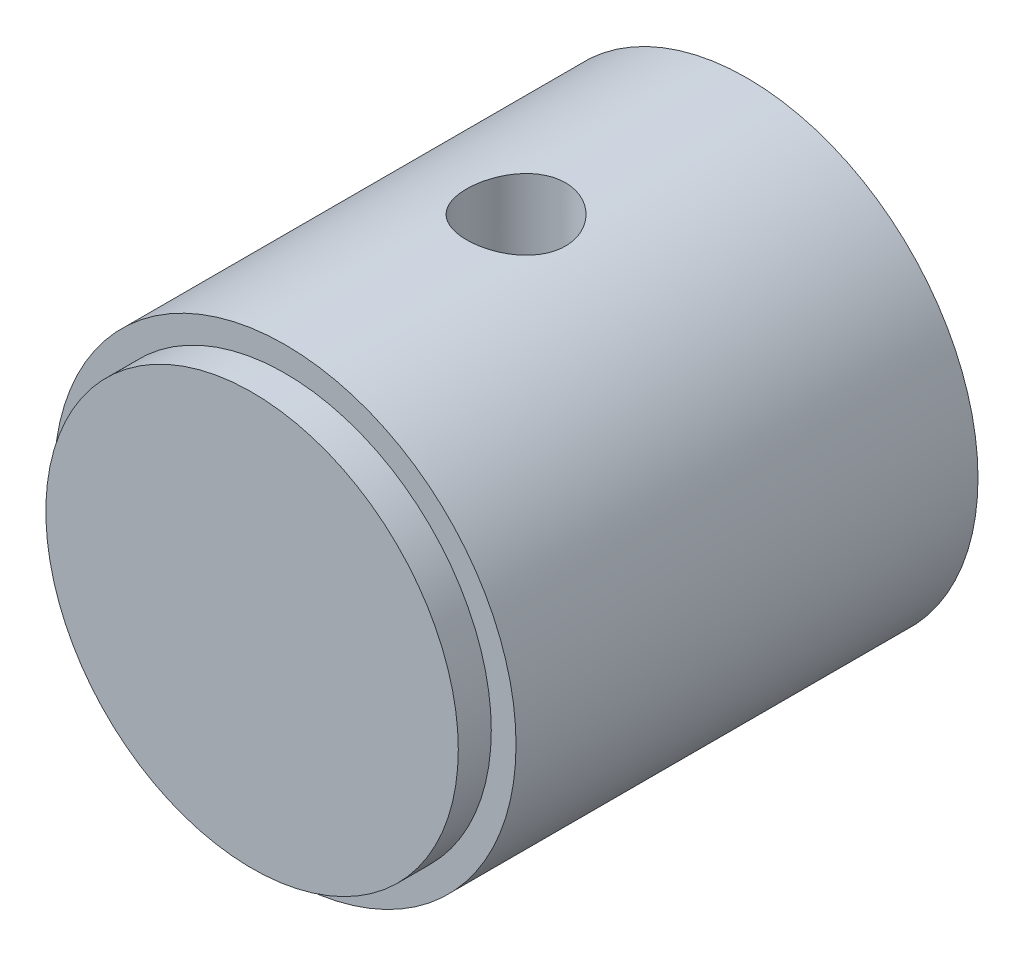
ISO-10303-21;
HEADER;
FILE_DESCRIPTION(('STEP AP214'),'2;1');
FILE_NAME('part.step','',(''),(''),'','','');
FILE_SCHEMA(('AUTOMOTIVE_DESIGN { 1 0 10303 214 1 1 1 1 }'));
ENDSEC;
DATA;
#1=APPLICATION_CONTEXT('core data for automotive mechanical design processes');
#2=APPLICATION_PROTOCOL_DEFINITION('international standard','automotive_design',2000,#1);
#3=PRODUCT_CONTEXT('',#1,'mechanical');
#4=PRODUCT('Part','Part','',(#3));
#5=PRODUCT_RELATED_PRODUCT_CATEGORY('part','',(#4));
#6=PRODUCT_DEFINITION_FORMATION('','',#4);
#7=PRODUCT_DEFINITION_CONTEXT('part definition',#1,'design');
#8=PRODUCT_DEFINITION('design','',#6,#7);
#9=PRODUCT_DEFINITION_SHAPE('','',#8);
#10=(LENGTH_UNIT() NAMED_UNIT(*) SI_UNIT(.MILLI.,.METRE.));
#11=(NAMED_UNIT(*) PLANE_ANGLE_UNIT() SI_UNIT($,.RADIAN.));
#12=(NAMED_UNIT(*) SI_UNIT($,.STERADIAN.) SOLID_ANGLE_UNIT());
#13=UNCERTAINTY_MEASURE_WITH_UNIT(LENGTH_MEASURE(1.E-05),#10,'distance_accuracy_value','');
#14=(GEOMETRIC_REPRESENTATION_CONTEXT(3) GLOBAL_UNCERTAINTY_ASSIGNED_CONTEXT((#13)) GLOBAL_UNIT_ASSIGNED_CONTEXT((#10,
#11,#12)) REPRESENTATION_CONTEXT('',''));
#15=CARTESIAN_POINT('',(0.,0.,0.));
#16=DIRECTION('',(0.,0.,1.));
#17=DIRECTION('',(1.,0.,0.));
#18=AXIS2_PLACEMENT_3D('',#15,#16,#17);
#19=CARTESIAN_POINT('',(0.,0.,7.));
#20=DIRECTION('',(0.,0.,-1.));
#21=DIRECTION('',(-1.,0.,0.));
#22=AXIS2_PLACEMENT_3D('',#19,#20,#21);
#23=CYLINDRICAL_SURFACE('',#22,7.);
#24=CARTESIAN_POINT('',(0.,-7.,1.5));
#25=CARTESIAN_POINT('',(0.0832358860906166,-6.99999846043226,1.4999971004257));
#26=CARTESIAN_POINT('',(0.166507195600275,-6.9985002594971,1.49304839161214));
#27=CARTESIAN_POINT('',(0.330687344293327,-6.99266829827728,1.46546434314641));
#28=CARTESIAN_POINT('',(0.41159440357119,-6.98833245637099,1.44481895580507));
#29=CARTESIAN_POINT('',(0.568649323817736,-6.97730831788826,1.39051563539196));
#30=CARTESIAN_POINT('',(0.644801963446555,-6.97062242967171,1.35687102061868));
#31=CARTESIAN_POINT('',(0.790378177960787,-6.9556210681797,1.27756591382874));
#32=CARTESIAN_POINT('',(0.859801981747369,-6.94730565036661,1.23190583075006));
#33=CARTESIAN_POINT('',(0.991024790535229,-6.92981369246311,1.12911970032649));
#34=CARTESIAN_POINT('',(1.05270503419445,-6.92062683143259,1.07184377810147));
#35=CARTESIAN_POINT('',(1.16566042389435,-6.90250069814144,0.947773684314803));
#36=CARTESIAN_POINT('',(1.21693467150908,-6.8935614473163,0.880978691748742));
#37=CARTESIAN_POINT('',(1.30814204379809,-6.87684116047225,0.738894247139567));
#38=CARTESIAN_POINT('',(1.34794958335009,-6.8690733634436,0.66352248224379));
#39=CARTESIAN_POINT('',(1.41428823691148,-6.85572325558537,0.506965546233162));
#40=CARTESIAN_POINT('',(1.44082087001716,-6.85014069470711,0.425781041507426));
#41=CARTESIAN_POINT('',(1.47946574422454,-6.84189808926311,0.261188913411926));
#42=CARTESIAN_POINT('',(1.49178779748342,-6.83919556896486,0.177832724336135));
#43=CARTESIAN_POINT('',(1.50231395206577,-6.83689139845106,0.0101957674930052));
#44=CARTESIAN_POINT('',(1.50051971664629,-6.83728938291729,-0.0740848901799469));
#45=CARTESIAN_POINT('',(1.48303326340861,-6.84110276603832,-0.239624687933792));
#46=CARTESIAN_POINT('',(1.46758398649408,-6.84446541682162,-0.320910889100153));
#47=CARTESIAN_POINT('',(1.42361054298677,-6.85374593375788,-0.479710240289342));
#48=CARTESIAN_POINT('',(1.39508566936466,-6.85966393808402,-0.557223186032321));
#49=CARTESIAN_POINT('',(1.32554551075991,-6.87344080755724,-0.706962872873338));
#50=CARTESIAN_POINT('',(1.2844361097283,-6.88131420983365,-0.779144512712551));
#51=CARTESIAN_POINT('',(1.19096007283993,-6.89810572501288,-0.915675164957958));
#52=CARTESIAN_POINT('',(1.13859196103562,-6.90702397481896,-0.980023148686202));
#53=CARTESIAN_POINT('',(1.0227954275532,-6.92512718393878,-1.1004593556734));
#54=CARTESIAN_POINT('',(0.95916023396441,-6.93431383972178,-1.15634870658474));
#55=CARTESIAN_POINT('',(0.823317306269096,-6.95175017497059,-1.25669373368966));
#56=CARTESIAN_POINT('',(0.7511094287754,-6.95999983875972,-1.30114921860039));
#57=CARTESIAN_POINT('',(0.599933462049959,-6.97465778534003,-1.37741067990693));
#58=CARTESIAN_POINT('',(0.520952258863482,-6.98106238643354,-1.40919141257798));
#59=CARTESIAN_POINT('',(0.358603146685706,-6.99128109245334,-1.45897564832109));
#60=CARTESIAN_POINT('',(0.275235851133669,-6.99509555860384,-1.47698107256332));
#61=CARTESIAN_POINT('',(0.108187670836629,-6.99965306347808,-1.49841621414342));
#62=CARTESIAN_POINT('',(0.0245431772716148,-7.00045336521066,-1.50211771288178));
#63=CARTESIAN_POINT('',(-0.142168973650405,-6.99905248935969,-1.49557542887484));
#64=CARTESIAN_POINT('',(-0.225236668127255,-6.99685150675698,-1.48533255203706));
#65=CARTESIAN_POINT('',(-0.387542537982806,-6.98973143045266,-1.4514177563383));
#66=CARTESIAN_POINT('',(-0.466811712908477,-6.9848410504546,-1.42788763052747));
#67=CARTESIAN_POINT('',(-0.620278450473418,-6.9728892442151,-1.36822305700518));
#68=CARTESIAN_POINT('',(-0.69447559258774,-6.96582763822237,-1.33208756568835));
#69=CARTESIAN_POINT('',(-0.836821397964754,-6.950175043904,-1.24766645693967));
#70=CARTESIAN_POINT('',(-0.90487257511114,-6.94156431354275,-1.19922020509027));
#71=CARTESIAN_POINT('',(-1.0319769255236,-6.92381033034847,-1.09176517511126));
#72=CARTESIAN_POINT('',(-1.091028978692,-6.91466701142097,-1.03275508411256));
#73=CARTESIAN_POINT('',(-1.19952711057989,-6.89668172706324,-0.904602629812864));
#74=CARTESIAN_POINT('',(-1.24878537255157,-6.88784792221285,-0.835299900777896));
#75=CARTESIAN_POINT('',(-1.3349641538604,-6.87166654559681,-0.689245403522007));
#76=CARTESIAN_POINT('',(-1.37188519913706,-6.86431891048055,-0.612493953022508));
#77=CARTESIAN_POINT('',(-1.43209741248548,-6.8520100980739,-0.454127701005397));
#78=CARTESIAN_POINT('',(-1.45546398641275,-6.84703574582967,-0.372542643569332));
#79=CARTESIAN_POINT('',(-1.48812696085335,-6.84001186708418,-0.206484416166364));
#80=CARTESIAN_POINT('',(-1.49742550780258,-6.83796189439706,-0.12201168879868));
#81=CARTESIAN_POINT('',(-1.5015999992604,-6.83704618848155,0.0455323431752432));
#82=CARTESIAN_POINT('',(-1.49677347258311,-6.83811476518543,0.128596014980579));
#83=CARTESIAN_POINT('',(-1.47349789406331,-6.8431676318483,0.292697242132587));
#84=CARTESIAN_POINT('',(-1.45504898957979,-6.84715189026714,0.373734819386574));
#85=CARTESIAN_POINT('',(-1.40519345940434,-6.85755581104157,0.531258657869168));
#86=CARTESIAN_POINT('',(-1.37382847170887,-6.86396764224703,0.607758648664291));
#87=CARTESIAN_POINT('',(-1.29906751595601,-6.87850764590649,0.75445537250685));
#88=CARTESIAN_POINT('',(-1.255670353015,-6.88663598880363,0.824651478615045));
#89=CARTESIAN_POINT('',(-1.15708290349304,-6.90389055593232,0.958218193725365));
#90=CARTESIAN_POINT('',(-1.10167987421237,-6.91303309938926,1.02142969594698));
#91=CARTESIAN_POINT('',(-0.981086554619621,-6.93117449799694,1.13775626252046));
#92=CARTESIAN_POINT('',(-0.915894009385597,-6.94017331951296,1.19086899431221));
#93=CARTESIAN_POINT('',(-0.776603147268716,-6.95714491048987,1.28611595950556));
#94=CARTESIAN_POINT('',(-0.70240484600964,-6.96510364570626,1.32810660623098));
#95=CARTESIAN_POINT('',(-0.547850160940597,-6.97895826104019,1.39895452890618));
#96=CARTESIAN_POINT('',(-0.467499105863879,-6.98485590212343,1.42782302258504));
#97=CARTESIAN_POINT('',(-0.322535217553204,-6.99284848461772,1.46635218513115));
#98=CARTESIAN_POINT('',(-0.258717205545979,-6.99551391888263,1.47894643398003));
#99=CARTESIAN_POINT('',(-0.129939960853847,-6.99909024154719,1.49577130171167));
#100=CARTESIAN_POINT('',(-0.0649807750887453,-7.00000120191314,1.50000226364606));
#101=CARTESIAN_POINT('',(0.,-7.,1.5));
#102=B_SPLINE_CURVE_WITH_KNOTS('',3,(#24,#25,#26,#27,#28,#29,#30,#31,#32,#33,#34,#35,#36,#37,
#38,#39,#40,#41,#42,#43,#44,#45,#46,#47,#48,#49,#50,#51,#52,#53,#54,#55,#56,#57,#58,#59,#60,#61,
#62,#63,#64,#65,#66,#67,#68,#69,#70,#71,#72,#73,#74,#75,#76,#77,#78,#79,#80,#81,#82,#83,#84,#85,
#86,#87,#88,#89,#90,#91,#92,#93,#94,#95,#96,#97,#98,#99,#100,#101),.UNSPECIFIED.,.T.,.F.,(4,2,2,
2,2,2,2,2,2,2,2,2,2,2,2,2,2,2,2,2,2,2,2,2,2,2,2,2,2,2,2,2,2,2,2,2,2,2,4),(0.,0.249469836512082,
0.499122883219936,0.748520824425602,0.997910278645886,1.25074961881732,1.50361077918506,
1.7591442921451,2.0146485567749,2.26633008124666,2.51798195169165,2.76524475452928,
3.01252092904568,3.26169356165968,3.51089887920889,3.76527011050291,4.0196455970235,
4.27452521139806,4.52936927256343,4.77934665704185,5.02930780231429,5.27665060589267,
5.52401389198434,5.77478733867803,6.02559197304485,6.28082063283534,6.53603841075806,
6.78982240408475,7.04356767229185,7.29200680540294,7.5404432510827,7.78808499706785,
8.03575134451623,8.28822950154114,8.54076590397115,8.79641910357222,9.05185334010271,
9.24661799132294,9.44137465337336),.UNSPECIFIED.);
#103=CARTESIAN_POINT('',(0.,-7.,1.5));
#104=VERTEX_POINT('',#103);
#105=EDGE_CURVE('E99',#104,#104,#102,.T.);
#106=ORIENTED_EDGE('',*,*,#105,.T.);
#107=EDGE_LOOP('',(#106));
#108=FACE_BOUND('',#107,.T.);
#109=CARTESIAN_POINT('',(0.,7.,1.5));
#110=CARTESIAN_POINT('',(-0.0832358860906166,6.99999846043226,1.4999971004257));
#111=CARTESIAN_POINT('',(-0.166507195600275,6.9985002594971,1.49304839161214));
#112=CARTESIAN_POINT('',(-0.330687344293327,6.99266829827728,1.46546434314641));
#113=CARTESIAN_POINT('',(-0.41159440357119,6.98833245637099,1.44481895580507));
#114=CARTESIAN_POINT('',(-0.568649323817736,6.97730831788826,1.39051563539196));
#115=CARTESIAN_POINT('',(-0.644801963446555,6.97062242967171,1.35687102061868));
#116=CARTESIAN_POINT('',(-0.790378177960787,6.9556210681797,1.27756591382874));
#117=CARTESIAN_POINT('',(-0.859801981747369,6.94730565036661,1.23190583075006));
#118=CARTESIAN_POINT('',(-0.991024790535229,6.92981369246311,1.12911970032649));
#119=CARTESIAN_POINT('',(-1.05270503419445,6.92062683143259,1.07184377810147));
#120=CARTESIAN_POINT('',(-1.16566042389435,6.90250069814144,0.947773684314803));
#121=CARTESIAN_POINT('',(-1.21693467150908,6.8935614473163,0.880978691748742));
#122=CARTESIAN_POINT('',(-1.30814204379809,6.87684116047225,0.738894247139567));
#123=CARTESIAN_POINT('',(-1.34794958335009,6.8690733634436,0.66352248224379));
#124=CARTESIAN_POINT('',(-1.41428823691148,6.85572325558537,0.506965546233162));
#125=CARTESIAN_POINT('',(-1.44082087001716,6.85014069470711,0.425781041507426));
#126=CARTESIAN_POINT('',(-1.47946574422454,6.84189808926311,0.261188913411926));
#127=CARTESIAN_POINT('',(-1.49178779748342,6.83919556896486,0.177832724336135));
#128=CARTESIAN_POINT('',(-1.50231395206577,6.83689139845106,0.0101957674930052));
#129=CARTESIAN_POINT('',(-1.50051971664629,6.83728938291729,-0.0740848901799469));
#130=CARTESIAN_POINT('',(-1.48303326340861,6.84110276603832,-0.239624687933792));
#131=CARTESIAN_POINT('',(-1.46758398649408,6.84446541682162,-0.320910889100153));
#132=CARTESIAN_POINT('',(-1.42361054298677,6.85374593375788,-0.479710240289342));
#133=CARTESIAN_POINT('',(-1.39508566936466,6.85966393808402,-0.557223186032321));
#134=CARTESIAN_POINT('',(-1.32554551075991,6.87344080755724,-0.706962872873338));
#135=CARTESIAN_POINT('',(-1.2844361097283,6.88131420983365,-0.779144512712551));
#136=CARTESIAN_POINT('',(-1.19096007283993,6.89810572501288,-0.915675164957958));
#137=CARTESIAN_POINT('',(-1.13859196103562,6.90702397481896,-0.980023148686202));
#138=CARTESIAN_POINT('',(-1.0227954275532,6.92512718393878,-1.1004593556734));
#139=CARTESIAN_POINT('',(-0.95916023396441,6.93431383972178,-1.15634870658474));
#140=CARTESIAN_POINT('',(-0.823317306269096,6.95175017497059,-1.25669373368966));
#141=CARTESIAN_POINT('',(-0.7511094287754,6.95999983875972,-1.30114921860039));
#142=CARTESIAN_POINT('',(-0.599933462049959,6.97465778534003,-1.37741067990693));
#143=CARTESIAN_POINT('',(-0.520952258863482,6.98106238643354,-1.40919141257798));
#144=CARTESIAN_POINT('',(-0.358603146685706,6.99128109245334,-1.45897564832109));
#145=CARTESIAN_POINT('',(-0.275235851133669,6.99509555860384,-1.47698107256332));
#146=CARTESIAN_POINT('',(-0.108187670836629,6.99965306347808,-1.49841621414342));
#147=CARTESIAN_POINT('',(-0.0245431772716148,7.00045336521066,-1.50211771288178));
#148=CARTESIAN_POINT('',(0.142168973650405,6.99905248935969,-1.49557542887484));
#149=CARTESIAN_POINT('',(0.225236668127255,6.99685150675698,-1.48533255203706));
#150=CARTESIAN_POINT('',(0.387542537982806,6.98973143045266,-1.4514177563383));
#151=CARTESIAN_POINT('',(0.466811712908477,6.9848410504546,-1.42788763052747));
#152=CARTESIAN_POINT('',(0.620278450473418,6.9728892442151,-1.36822305700518));
#153=CARTESIAN_POINT('',(0.69447559258774,6.96582763822237,-1.33208756568835));
#154=CARTESIAN_POINT('',(0.836821397964754,6.950175043904,-1.24766645693967));
#155=CARTESIAN_POINT('',(0.90487257511114,6.94156431354275,-1.19922020509027));
#156=CARTESIAN_POINT('',(1.0319769255236,6.92381033034847,-1.09176517511126));
#157=CARTESIAN_POINT('',(1.091028978692,6.91466701142097,-1.03275508411256));
#158=CARTESIAN_POINT('',(1.19952711057989,6.89668172706324,-0.904602629812864));
#159=CARTESIAN_POINT('',(1.24878537255157,6.88784792221285,-0.835299900777896));
#160=CARTESIAN_POINT('',(1.3349641538604,6.87166654559681,-0.689245403522007));
#161=CARTESIAN_POINT('',(1.37188519913706,6.86431891048055,-0.612493953022508));
#162=CARTESIAN_POINT('',(1.43209741248548,6.8520100980739,-0.454127701005397));
#163=CARTESIAN_POINT('',(1.45546398641275,6.84703574582967,-0.372542643569332));
#164=CARTESIAN_POINT('',(1.48812696085335,6.84001186708418,-0.206484416166364));
#165=CARTESIAN_POINT('',(1.49742550780258,6.83796189439706,-0.12201168879868));
#166=CARTESIAN_POINT('',(1.5015999992604,6.83704618848155,0.0455323431752432));
#167=CARTESIAN_POINT('',(1.49677347258311,6.83811476518543,0.128596014980579));
#168=CARTESIAN_POINT('',(1.47349789406331,6.8431676318483,0.292697242132587));
#169=CARTESIAN_POINT('',(1.45504898957979,6.84715189026714,0.373734819386574));
#170=CARTESIAN_POINT('',(1.40519345940434,6.85755581104157,0.531258657869168));
#171=CARTESIAN_POINT('',(1.37382847170887,6.86396764224703,0.607758648664291));
#172=CARTESIAN_POINT('',(1.29906751595601,6.87850764590649,0.75445537250685));
#173=CARTESIAN_POINT('',(1.255670353015,6.88663598880363,0.824651478615045));
#174=CARTESIAN_POINT('',(1.15708290349304,6.90389055593232,0.958218193725365));
#175=CARTESIAN_POINT('',(1.10167987421237,6.91303309938926,1.02142969594698));
#176=CARTESIAN_POINT('',(0.981086554619621,6.93117449799694,1.13775626252046));
#177=CARTESIAN_POINT('',(0.915894009385597,6.94017331951296,1.19086899431221));
#178=CARTESIAN_POINT('',(0.776603147268716,6.95714491048987,1.28611595950556));
#179=CARTESIAN_POINT('',(0.70240484600964,6.96510364570626,1.32810660623098));
#180=CARTESIAN_POINT('',(0.547850160940597,6.97895826104019,1.39895452890618));
#181=CARTESIAN_POINT('',(0.467499105863879,6.98485590212343,1.42782302258504));
#182=CARTESIAN_POINT('',(0.322535217553204,6.99284848461772,1.46635218513115));
#183=CARTESIAN_POINT('',(0.258717205545979,6.99551391888263,1.47894643398003));
#184=CARTESIAN_POINT('',(0.129939960853847,6.99909024154719,1.49577130171167));
#185=CARTESIAN_POINT('',(0.0649807750887453,7.00000120191314,1.50000226364606));
#186=CARTESIAN_POINT('',(0.,7.,1.5));
#187=B_SPLINE_CURVE_WITH_KNOTS('',3,(#109,#110,#111,#112,#113,#114,#115,#116,#117,#118,#119,
#120,#121,#122,#123,#124,#125,#126,#127,#128,#129,#130,#131,#132,#133,#134,#135,#136,#137,#138,
#139,#140,#141,#142,#143,#144,#145,#146,#147,#148,#149,#150,#151,#152,#153,#154,#155,#156,#157,
#158,#159,#160,#161,#162,#163,#164,#165,#166,#167,#168,#169,#170,#171,#172,#173,#174,#175,#176,
#177,#178,#179,#180,#181,#182,#183,#184,#185,#186),.UNSPECIFIED.,.T.,.F.,(4,2,2,2,2,2,2,2,2,2,2,
2,2,2,2,2,2,2,2,2,2,2,2,2,2,2,2,2,2,2,2,2,2,2,2,2,2,2,4),(0.,0.249469836512082,
0.499122883219936,0.748520824425602,0.997910278645886,1.25074961881732,1.50361077918506,
1.7591442921451,2.0146485567749,2.26633008124666,2.51798195169165,2.76524475452928,
3.01252092904568,3.26169356165968,3.51089887920889,3.76527011050291,4.0196455970235,
4.27452521139806,4.52936927256343,4.77934665704185,5.02930780231429,5.27665060589267,
5.52401389198434,5.77478733867803,6.02559197304485,6.28082063283534,6.53603841075806,
6.78982240408475,7.04356767229185,7.29200680540294,7.5404432510827,7.78808499706785,
8.03575134451623,8.28822950154114,8.54076590397115,8.79641910357222,9.05185334010271,
9.24661799132294,9.44137465337336),.UNSPECIFIED.);
#188=CARTESIAN_POINT('',(0.,7.,1.5));
#189=VERTEX_POINT('',#188);
#190=EDGE_CURVE('E94',#189,#189,#187,.T.);
#191=ORIENTED_EDGE('',*,*,#190,.T.);
#192=EDGE_LOOP('',(#191));
#193=FACE_BOUND('',#192,.T.);
#194=CARTESIAN_POINT('',(0.,0.,7.));
#195=DIRECTION('',(0.,0.,1.));
#196=DIRECTION('',(1.,0.,0.));
#197=AXIS2_PLACEMENT_3D('',#194,#195,#196);
#198=CIRCLE('',#197,7.);
#199=CARTESIAN_POINT('',(7.,0.,7.));
#200=VERTEX_POINT('',#199);
#201=EDGE_CURVE('E11',#200,#200,#198,.T.);
#202=ORIENTED_EDGE('',*,*,#201,.F.);
#203=EDGE_LOOP('',(#202));
#204=FACE_BOUND('',#203,.T.);
#205=CARTESIAN_POINT('',(0.,0.,-7.));
#206=DIRECTION('',(0.,0.,1.));
#207=DIRECTION('',(1.,0.,0.));
#208=AXIS2_PLACEMENT_3D('',#205,#206,#207);
#209=CIRCLE('',#208,7.);
#210=CARTESIAN_POINT('',(7.,0.,-7.));
#211=VERTEX_POINT('',#210);
#212=EDGE_CURVE('E49',#211,#211,#209,.T.);
#213=ORIENTED_EDGE('',*,*,#212,.T.);
#214=EDGE_LOOP('',(#213));
#215=FACE_BOUND('',#214,.T.);
#216=ADVANCED_FACE('F36',(#108,#193,#204,#215),#23,.T.);
#217=CARTESIAN_POINT('',(0.,0.,7.));
#218=DIRECTION('',(0.,0.,1.));
#219=DIRECTION('',(1.,0.,0.));
#220=AXIS2_PLACEMENT_3D('',#217,#218,#219);
#221=PLANE('',#220);
#222=CARTESIAN_POINT('',(0.,0.,7.));
#223=DIRECTION('',(0.,0.,1.));
#224=DIRECTION('',(1.,0.,0.));
#225=AXIS2_PLACEMENT_3D('',#222,#223,#224);
#226=CIRCLE('',#225,6.25);
#227=CARTESIAN_POINT('',(6.25,0.,7.));
#228=VERTEX_POINT('',#227);
#229=EDGE_CURVE('E67',#228,#228,#226,.F.);
#230=ORIENTED_EDGE('',*,*,#229,.T.);
#231=EDGE_LOOP('',(#230));
#232=FACE_BOUND('',#231,.T.);
#233=ORIENTED_EDGE('',*,*,#201,.T.);
#234=EDGE_LOOP('',(#233));
#235=FACE_BOUND('',#234,.T.);
#236=ADVANCED_FACE('F112',(#232,#235),#221,.T.);
#237=CARTESIAN_POINT('',(0.,0.,-7.));
#238=DIRECTION('',(0.,0.,1.));
#239=DIRECTION('',(1.,0.,0.));
#240=AXIS2_PLACEMENT_3D('',#237,#238,#239);
#241=PLANE('',#240);
#242=CARTESIAN_POINT('',(0.,0.,-7.));
#243=DIRECTION('',(0.,0.,-1.));
#244=DIRECTION('',(-1.,0.,0.));
#245=AXIS2_PLACEMENT_3D('',#242,#243,#244);
#246=CIRCLE('',#245,6.2);
#247=CARTESIAN_POINT('',(-6.2,0.,-7.));
#248=VERTEX_POINT('',#247);
#249=EDGE_CURVE('E70',#248,#248,#246,.T.);
#250=ORIENTED_EDGE('',*,*,#249,.F.);
#251=EDGE_LOOP('',(#250));
#252=FACE_BOUND('',#251,.T.);
#253=ORIENTED_EDGE('',*,*,#212,.F.);
#254=EDGE_LOOP('',(#253));
#255=FACE_BOUND('',#254,.T.);
#256=ADVANCED_FACE('F108',(#252,#255),#241,.F.);
#257=CARTESIAN_POINT('',(0.,0.,8.));
#258=DIRECTION('',(0.,0.,-1.));
#259=DIRECTION('',(-1.,0.,0.));
#260=AXIS2_PLACEMENT_3D('',#257,#258,#259);
#261=CYLINDRICAL_SURFACE('',#260,6.25);
#262=ORIENTED_EDGE('',*,*,#229,.F.);
#263=EDGE_LOOP('',(#262));
#264=FACE_BOUND('',#263,.T.);
#265=CARTESIAN_POINT('',(0.,0.,8.));
#266=DIRECTION('',(0.,0.,1.));
#267=DIRECTION('',(1.,0.,0.));
#268=AXIS2_PLACEMENT_3D('',#265,#266,#267);
#269=CIRCLE('',#268,6.25);
#270=CARTESIAN_POINT('',(6.25,0.,8.));
#271=VERTEX_POINT('',#270);
#272=EDGE_CURVE('E63',#271,#271,#269,.T.);
#273=ORIENTED_EDGE('',*,*,#272,.F.);
#274=EDGE_LOOP('',(#273));
#275=FACE_BOUND('',#274,.T.);
#276=ADVANCED_FACE('F111',(#264,#275),#261,.T.);
#277=CARTESIAN_POINT('',(0.,0.,8.));
#278=DIRECTION('',(0.,0.,1.));
#279=DIRECTION('',(1.,0.,0.));
#280=AXIS2_PLACEMENT_3D('',#277,#278,#279);
#281=PLANE('',#280);
#282=ORIENTED_EDGE('',*,*,#272,.T.);
#283=EDGE_LOOP('',(#282));
#284=FACE_BOUND('',#283,.T.);
#285=ADVANCED_FACE('F141',(#284),#281,.T.);
#286=CARTESIAN_POINT('',(0.,0.,-7.));
#287=DIRECTION('',(0.,0.,-1.));
#288=DIRECTION('',(-1.,0.,0.));
#289=AXIS2_PLACEMENT_3D('',#286,#287,#288);
#290=CONICAL_SURFACE('',#289,6.2,0.349065850398866);
#291=CARTESIAN_POINT('',(0.,0.,-3.01615774179079));
#292=DIRECTION('',(0.,0.,-1.));
#293=DIRECTION('',(-1.,0.,0.));
#294=AXIS2_PLACEMENT_3D('',#291,#292,#293);
#295=CIRCLE('',#294,4.75);
#296=CARTESIAN_POINT('',(-4.75,0.,-3.01615774179079));
#297=VERTEX_POINT('',#296);
#298=EDGE_CURVE('E64',#297,#297,#295,.T.);
#299=ORIENTED_EDGE('',*,*,#298,.F.);
#300=EDGE_LOOP('',(#299));
#301=FACE_BOUND('',#300,.T.);
#302=ORIENTED_EDGE('',*,*,#249,.T.);
#303=EDGE_LOOP('',(#302));
#304=FACE_BOUND('',#303,.T.);
#305=ADVANCED_FACE('F57',(#301,#304),#290,.F.);
#306=CARTESIAN_POINT('',(0.,0.,4.));
#307=DIRECTION('',(0.,0.,-1.));
#308=DIRECTION('',(-1.,0.,0.));
#309=AXIS2_PLACEMENT_3D('',#306,#307,#308);
#310=CONICAL_SURFACE('',#309,4.75,1.02974425867665);
#311=CARTESIAN_POINT('',(0.,0.,6.85408794038091));
#312=VERTEX_POINT('',#311);
#313=VERTEX_LOOP('',#312);
#314=FACE_BOUND('',#313,.T.);
#315=CARTESIAN_POINT('',(0.,0.,4.));
#316=DIRECTION('',(0.,0.,-1.));
#317=DIRECTION('',(-1.,0.,0.));
#318=AXIS2_PLACEMENT_3D('',#315,#316,#317);
#319=CIRCLE('',#318,4.75);
#320=CARTESIAN_POINT('',(-4.75,0.,4.));
#321=VERTEX_POINT('',#320);
#322=EDGE_CURVE('E61',#321,#321,#319,.T.);
#323=ORIENTED_EDGE('',*,*,#322,.T.);
#324=EDGE_LOOP('',(#323));
#325=FACE_BOUND('',#324,.T.);
#326=ADVANCED_FACE('F53',(#314,#325),#310,.F.);
#327=CARTESIAN_POINT('',(0.,0.,-7.));
#328=DIRECTION('',(0.,0.,-1.));
#329=DIRECTION('',(-1.,0.,0.));
#330=AXIS2_PLACEMENT_3D('',#327,#328,#329);
#331=CYLINDRICAL_SURFACE('',#330,4.75);
#332=CARTESIAN_POINT('',(0.,-4.75,1.5));
#333=CARTESIAN_POINT('',(-0.0820835447314044,-4.74999967904615,1.4999995960029));
#334=CARTESIAN_POINT('',(-0.164171496501827,-4.74785228936723,1.49324013050539));
#335=CARTESIAN_POINT('',(-0.325944116631497,-4.73949648091444,1.46645355077682));
#336=CARTESIAN_POINT('',(-0.405628283459122,-4.73328722070904,1.44642368752273));
#337=CARTESIAN_POINT('',(-0.560237269504344,-4.71748543187023,1.39384104381599));
#338=CARTESIAN_POINT('',(-0.63516933409095,-4.7078982073406,1.36130788889304));
#339=CARTESIAN_POINT('',(-0.778514579207214,-4.68632862599565,1.28472646357131));
#340=CARTESIAN_POINT('',(-0.846926688392994,-4.67434587655187,1.24067630516156));
#341=CARTESIAN_POINT('',(-0.977443078754498,-4.64883376662147,1.14085266257358));
#342=CARTESIAN_POINT('',(-1.03931346588882,-4.63527018347254,1.08478215126322));
#343=CARTESIAN_POINT('',(-1.15294742613925,-4.60832176901776,0.96314171987723));
#344=CARTESIAN_POINT('',(-1.2047090669501,-4.5949369723419,0.897569987790587));
#345=CARTESIAN_POINT('',(-1.29793466853577,-4.56949296853185,0.756751217884121));
#346=CARTESIAN_POINT('',(-1.33910462019172,-4.55747591989588,0.681301196555855));
#347=CARTESIAN_POINT('',(-1.40807389327236,-4.53664362085522,0.524107538223758));
#348=CARTESIAN_POINT('',(-1.43587682167781,-4.52782750686213,0.442365605954657));
#349=CARTESIAN_POINT('',(-1.47646364106285,-4.51475360613692,0.277551097630557));
#350=CARTESIAN_POINT('',(-1.48968210274354,-4.51036428133252,0.1945962655912));
#351=CARTESIAN_POINT('',(-1.50208257395981,-4.50625061102434,0.0275391017801469));
#352=CARTESIAN_POINT('',(-1.50126840605207,-4.50652499510326,-0.0565629112565515));
#353=CARTESIAN_POINT('',(-1.48596623804715,-4.51159176137022,-0.219915518838901));
#354=CARTESIAN_POINT('',(-1.47203288124122,-4.5162008739663,-0.299224716240831));
#355=CARTESIAN_POINT('',(-1.43178798005592,-4.52911970742075,-0.4543165274426));
#356=CARTESIAN_POINT('',(-1.40547509472982,-4.53742982916608,-0.53009875822503));
#357=CARTESIAN_POINT('',(-1.34083084084602,-4.55695325959034,-0.677297267875654));
#358=CARTESIAN_POINT('',(-1.30232683858134,-4.56820783899944,-0.748632023154815));
#359=CARTESIAN_POINT('',(-1.21451321691615,-4.59233341866295,-0.884008824349573));
#360=CARTESIAN_POINT('',(-1.16520074091948,-4.60520484585311,-0.948048935534489));
#361=CARTESIAN_POINT('',(-1.05445721763047,-4.63184688202887,-1.0701513614985));
#362=CARTESIAN_POINT('',(-0.992568961591256,-4.64563145900086,-1.12779672907412));
#363=CARTESIAN_POINT('',(-0.859832533931192,-4.67201892608795,-1.2319932402701));
#364=CARTESIAN_POINT('',(-0.78898367078958,-4.68462172487032,-1.27854352684441));
#365=CARTESIAN_POINT('',(-0.639521244304239,-4.70736283385871,-1.35951904447478));
#366=CARTESIAN_POINT('',(-0.56084940322956,-4.71748034190943,-1.3938429460244));
#367=CARTESIAN_POINT('',(-0.398454273025006,-4.73396063106369,-1.44864477780197));
#368=CARTESIAN_POINT('',(-0.314732560358458,-4.74032457733139,-1.46912700498973));
#369=CARTESIAN_POINT('',(-0.148151942001064,-4.74839235389519,-1.49494945913915));
#370=CARTESIAN_POINT('',(-0.0653887879529914,-4.75026975398177,-1.50085396580235));
#371=CARTESIAN_POINT('',(0.0999556894804191,-4.74966735792892,-1.49894688258364));
#372=CARTESIAN_POINT('',(0.182537038204381,-4.74718821327919,-1.49113734353799));
#373=CARTESIAN_POINT('',(0.342984606452104,-4.73826543461407,-1.46247591011593));
#374=CARTESIAN_POINT('',(0.420917353280694,-4.73192442641254,-1.44196140872058));
#375=CARTESIAN_POINT('',(0.572211571751271,-4.71602217273612,-1.38888562686362));
#376=CARTESIAN_POINT('',(0.645572474036246,-4.70646052712339,-1.35632284945278));
#377=CARTESIAN_POINT('',(0.787656381223483,-4.68480447515659,-1.2791769099363));
#378=CARTESIAN_POINT('',(0.856220098995368,-4.67265334948307,-1.23431674292693));
#379=CARTESIAN_POINT('',(0.985034898254589,-4.64720609363859,-1.13418067887393));
#380=CARTESIAN_POINT('',(1.04528367215737,-4.63390964727142,-1.07890190045924));
#381=CARTESIAN_POINT('',(1.15829337789972,-4.60699149316922,-0.956843403257349));
#382=CARTESIAN_POINT('',(1.21065200367447,-4.593378435549,-0.889688439428549));
#383=CARTESIAN_POINT('',(1.3033950666371,-4.5679297313532,-0.747249961456589));
#384=CARTESIAN_POINT('',(1.34377965554056,-4.55609406225838,-0.67196655032041));
#385=CARTESIAN_POINT('',(1.41118548758715,-4.53566962908159,-0.515538051119367));
#386=CARTESIAN_POINT('',(1.43825519702983,-4.52706911631109,-0.434415473075745));
#387=CARTESIAN_POINT('',(1.47824972090378,-4.5141696846939,-0.268435199877373));
#388=CARTESIAN_POINT('',(1.49118006577835,-4.50986908404445,-0.183578978611894));
#389=CARTESIAN_POINT('',(1.50212620605735,-4.50623416787646,-0.0167530740697966));
#390=CARTESIAN_POINT('',(1.50080314084641,-4.50667969384457,0.0651689599984466));
#391=CARTESIAN_POINT('',(1.48488083195079,-4.51195053556041,0.227561657886264));
#392=CARTESIAN_POINT('',(1.47028223238921,-4.51677563881295,0.308032391929095));
#393=CARTESIAN_POINT('',(1.42866989928935,-4.53010652438159,0.464028470782517));
#394=CARTESIAN_POINT('',(1.40184917312304,-4.53855497041869,0.539610572788346));
#395=CARTESIAN_POINT('',(1.33670650315647,-4.55816492249634,0.685261995788799));
#396=CARTESIAN_POINT('',(1.29838218467217,-4.56932698861838,0.755330174772464));
#397=CARTESIAN_POINT('',(1.2095354013046,-4.59366117792159,0.890986745297526));
#398=CARTESIAN_POINT('',(1.15858784628932,-4.60689565835744,0.956285508268395));
#399=CARTESIAN_POINT('',(1.0466842406539,-4.63360081206468,1.07762083763069));
#400=CARTESIAN_POINT('',(0.985725490335815,-4.64707154816902,1.13365489742713));
#401=CARTESIAN_POINT('',(0.85306632642395,-4.67327443028954,1.23675692430509));
#402=CARTESIAN_POINT('',(0.781073823515225,-4.68596655437371,1.28346039072967));
#403=CARTESIAN_POINT('',(0.62985947284286,-4.70867379243004,1.36404168437099));
#404=CARTESIAN_POINT('',(0.550640331972044,-4.71868990328235,1.39792428963458));
#405=CARTESIAN_POINT('',(0.393635914977816,-4.7342664308075,1.44959876910323));
#406=CARTESIAN_POINT('',(0.316225133186438,-4.74011460510933,1.46844387958559));
#407=CARTESIAN_POINT('',(0.159210635950566,-4.7479811380776,1.49364336266444));
#408=CARTESIAN_POINT('',(0.0796073905560845,-4.75000031127187,1.50000039181002));
#409=CARTESIAN_POINT('',(0.,-4.75,1.5));
#410=B_SPLINE_CURVE_WITH_KNOTS('',3,(#332,#333,#334,#335,#336,#337,#338,#339,#340,#341,#342,
#343,#344,#345,#346,#347,#348,#349,#350,#351,#352,#353,#354,#355,#356,#357,#358,#359,#360,#361,
#362,#363,#364,#365,#366,#367,#368,#369,#370,#371,#372,#373,#374,#375,#376,#377,#378,#379,#380,
#381,#382,#383,#384,#385,#386,#387,#388,#389,#390,#391,#392,#393,#394,#395,#396,#397,#398,#399,
#400,#401,#402,#403,#404,#405,#406,#407,#408,#409),.UNSPECIFIED.,.T.,.F.,(4,2,2,2,2,2,2,2,2,2,2,
2,2,2,2,2,2,2,2,2,2,2,2,2,2,2,2,2,2,2,2,2,2,2,2,2,2,2,4),(0.,0.24595797085269,0.49196690895122,
0.737591271008995,0.983255924152798,1.23588716608584,1.4885666517754,1.74764569043262,
2.00665477945945,2.25771831624514,2.50871346318116,2.74955211816805,2.99041686673246,
3.23485763830864,3.47936309176113,3.73524847406481,3.99115361598384,4.24913282924923,
4.50703191953741,4.75477968540458,5.00249040554177,5.24388939060298,5.48531837858214,
5.73270991189647,5.98016996447342,6.23765665880274,6.49514009053907,6.75167921313646,
7.00811795759371,7.25271509638717,7.49730036806766,7.73815036093371,7.97905010664366,
8.22954585775128,8.48010927077556,8.73909121554316,8.99797654827697,9.23656564494835,
9.47510398183575),.UNSPECIFIED.);
#411=CARTESIAN_POINT('',(0.,-4.75,1.5));
#412=VERTEX_POINT('',#411);
#413=EDGE_CURVE('E40',#412,#412,#410,.T.);
#414=ORIENTED_EDGE('',*,*,#413,.T.);
#415=EDGE_LOOP('',(#414));
#416=FACE_BOUND('',#415,.T.);
#417=CARTESIAN_POINT('',(0.,4.75,1.5));
#418=CARTESIAN_POINT('',(0.0820835447314044,4.74999967904615,1.4999995960029));
#419=CARTESIAN_POINT('',(0.164171496501827,4.74785228936723,1.49324013050539));
#420=CARTESIAN_POINT('',(0.325944116631497,4.73949648091444,1.46645355077682));
#421=CARTESIAN_POINT('',(0.405628283459122,4.73328722070904,1.44642368752273));
#422=CARTESIAN_POINT('',(0.560237269504344,4.71748543187023,1.39384104381599));
#423=CARTESIAN_POINT('',(0.63516933409095,4.7078982073406,1.36130788889304));
#424=CARTESIAN_POINT('',(0.778514579207214,4.68632862599565,1.28472646357131));
#425=CARTESIAN_POINT('',(0.846926688392994,4.67434587655187,1.24067630516156));
#426=CARTESIAN_POINT('',(0.977443078754498,4.64883376662147,1.14085266257358));
#427=CARTESIAN_POINT('',(1.03931346588882,4.63527018347254,1.08478215126322));
#428=CARTESIAN_POINT('',(1.15294742613925,4.60832176901776,0.96314171987723));
#429=CARTESIAN_POINT('',(1.2047090669501,4.5949369723419,0.897569987790587));
#430=CARTESIAN_POINT('',(1.29793466853577,4.56949296853185,0.756751217884121));
#431=CARTESIAN_POINT('',(1.33910462019172,4.55747591989588,0.681301196555855));
#432=CARTESIAN_POINT('',(1.40807389327236,4.53664362085522,0.524107538223758));
#433=CARTESIAN_POINT('',(1.43587682167781,4.52782750686213,0.442365605954657));
#434=CARTESIAN_POINT('',(1.47646364106285,4.51475360613692,0.277551097630557));
#435=CARTESIAN_POINT('',(1.48968210274354,4.51036428133252,0.1945962655912));
#436=CARTESIAN_POINT('',(1.50208257395981,4.50625061102434,0.0275391017801469));
#437=CARTESIAN_POINT('',(1.50126840605207,4.50652499510326,-0.0565629112565515));
#438=CARTESIAN_POINT('',(1.48596623804715,4.51159176137022,-0.219915518838901));
#439=CARTESIAN_POINT('',(1.47203288124122,4.5162008739663,-0.299224716240831));
#440=CARTESIAN_POINT('',(1.43178798005592,4.52911970742075,-0.4543165274426));
#441=CARTESIAN_POINT('',(1.40547509472982,4.53742982916608,-0.53009875822503));
#442=CARTESIAN_POINT('',(1.34083084084602,4.55695325959034,-0.677297267875654));
#443=CARTESIAN_POINT('',(1.30232683858134,4.56820783899944,-0.748632023154815));
#444=CARTESIAN_POINT('',(1.21451321691615,4.59233341866295,-0.884008824349573));
#445=CARTESIAN_POINT('',(1.16520074091948,4.60520484585311,-0.948048935534489));
#446=CARTESIAN_POINT('',(1.05445721763047,4.63184688202887,-1.0701513614985));
#447=CARTESIAN_POINT('',(0.992568961591256,4.64563145900086,-1.12779672907412));
#448=CARTESIAN_POINT('',(0.859832533931192,4.67201892608795,-1.2319932402701));
#449=CARTESIAN_POINT('',(0.78898367078958,4.68462172487032,-1.27854352684441));
#450=CARTESIAN_POINT('',(0.639521244304239,4.70736283385871,-1.35951904447478));
#451=CARTESIAN_POINT('',(0.56084940322956,4.71748034190943,-1.3938429460244));
#452=CARTESIAN_POINT('',(0.398454273025006,4.73396063106369,-1.44864477780197));
#453=CARTESIAN_POINT('',(0.314732560358458,4.74032457733139,-1.46912700498973));
#454=CARTESIAN_POINT('',(0.148151942001064,4.74839235389519,-1.49494945913915));
#455=CARTESIAN_POINT('',(0.0653887879529914,4.75026975398177,-1.50085396580235));
#456=CARTESIAN_POINT('',(-0.0999556894804191,4.74966735792892,-1.49894688258364));
#457=CARTESIAN_POINT('',(-0.182537038204381,4.74718821327919,-1.49113734353799));
#458=CARTESIAN_POINT('',(-0.342984606452104,4.73826543461407,-1.46247591011593));
#459=CARTESIAN_POINT('',(-0.420917353280694,4.73192442641254,-1.44196140872058));
#460=CARTESIAN_POINT('',(-0.572211571751271,4.71602217273612,-1.38888562686362));
#461=CARTESIAN_POINT('',(-0.645572474036246,4.70646052712339,-1.35632284945278));
#462=CARTESIAN_POINT('',(-0.787656381223483,4.68480447515659,-1.2791769099363));
#463=CARTESIAN_POINT('',(-0.856220098995368,4.67265334948307,-1.23431674292693));
#464=CARTESIAN_POINT('',(-0.985034898254589,4.64720609363859,-1.13418067887393));
#465=CARTESIAN_POINT('',(-1.04528367215737,4.63390964727142,-1.07890190045924));
#466=CARTESIAN_POINT('',(-1.15829337789972,4.60699149316922,-0.956843403257349));
#467=CARTESIAN_POINT('',(-1.21065200367447,4.593378435549,-0.889688439428549));
#468=CARTESIAN_POINT('',(-1.3033950666371,4.5679297313532,-0.747249961456589));
#469=CARTESIAN_POINT('',(-1.34377965554056,4.55609406225838,-0.67196655032041));
#470=CARTESIAN_POINT('',(-1.41118548758715,4.53566962908159,-0.515538051119367));
#471=CARTESIAN_POINT('',(-1.43825519702983,4.52706911631109,-0.434415473075745));
#472=CARTESIAN_POINT('',(-1.47824972090378,4.5141696846939,-0.268435199877373));
#473=CARTESIAN_POINT('',(-1.49118006577835,4.50986908404445,-0.183578978611894));
#474=CARTESIAN_POINT('',(-1.50212620605735,4.50623416787646,-0.0167530740697966));
#475=CARTESIAN_POINT('',(-1.50080314084641,4.50667969384457,0.0651689599984466));
#476=CARTESIAN_POINT('',(-1.48488083195079,4.51195053556041,0.227561657886264));
#477=CARTESIAN_POINT('',(-1.47028223238921,4.51677563881295,0.308032391929095));
#478=CARTESIAN_POINT('',(-1.42866989928935,4.53010652438159,0.464028470782517));
#479=CARTESIAN_POINT('',(-1.40184917312304,4.53855497041869,0.539610572788346));
#480=CARTESIAN_POINT('',(-1.33670650315647,4.55816492249634,0.685261995788799));
#481=CARTESIAN_POINT('',(-1.29838218467217,4.56932698861838,0.755330174772464));
#482=CARTESIAN_POINT('',(-1.2095354013046,4.59366117792159,0.890986745297526));
#483=CARTESIAN_POINT('',(-1.15858784628932,4.60689565835744,0.956285508268395));
#484=CARTESIAN_POINT('',(-1.0466842406539,4.63360081206468,1.07762083763069));
#485=CARTESIAN_POINT('',(-0.985725490335815,4.64707154816902,1.13365489742713));
#486=CARTESIAN_POINT('',(-0.85306632642395,4.67327443028954,1.23675692430509));
#487=CARTESIAN_POINT('',(-0.781073823515225,4.68596655437371,1.28346039072967));
#488=CARTESIAN_POINT('',(-0.62985947284286,4.70867379243004,1.36404168437099));
#489=CARTESIAN_POINT('',(-0.550640331972044,4.71868990328235,1.39792428963458));
#490=CARTESIAN_POINT('',(-0.393635914977816,4.7342664308075,1.44959876910323));
#491=CARTESIAN_POINT('',(-0.316225133186438,4.74011460510933,1.46844387958559));
#492=CARTESIAN_POINT('',(-0.159210635950566,4.7479811380776,1.49364336266444));
#493=CARTESIAN_POINT('',(-0.0796073905560845,4.75000031127187,1.50000039181002));
#494=CARTESIAN_POINT('',(0.,4.75,1.5));
#495=B_SPLINE_CURVE_WITH_KNOTS('',3,(#417,#418,#419,#420,#421,#422,#423,#424,#425,#426,#427,
#428,#429,#430,#431,#432,#433,#434,#435,#436,#437,#438,#439,#440,#441,#442,#443,#444,#445,#446,
#447,#448,#449,#450,#451,#452,#453,#454,#455,#456,#457,#458,#459,#460,#461,#462,#463,#464,#465,
#466,#467,#468,#469,#470,#471,#472,#473,#474,#475,#476,#477,#478,#479,#480,#481,#482,#483,#484,
#485,#486,#487,#488,#489,#490,#491,#492,#493,#494),.UNSPECIFIED.,.T.,.F.,(4,2,2,2,2,2,2,2,2,2,2,
2,2,2,2,2,2,2,2,2,2,2,2,2,2,2,2,2,2,2,2,2,2,2,2,2,2,2,4),(0.,0.24595797085269,0.49196690895122,
0.737591271008995,0.983255924152798,1.23588716608584,1.4885666517754,1.74764569043262,
2.00665477945945,2.25771831624514,2.50871346318116,2.74955211816805,2.99041686673246,
3.23485763830864,3.47936309176113,3.73524847406481,3.99115361598384,4.24913282924923,
4.50703191953741,4.75477968540458,5.00249040554177,5.24388939060298,5.48531837858214,
5.73270991189647,5.98016996447342,6.23765665880274,6.49514009053907,6.75167921313646,
7.00811795759371,7.25271509638717,7.49730036806766,7.73815036093371,7.97905010664366,
8.22954585775128,8.48010927077556,8.73909121554316,8.99797654827697,9.23656564494835,
9.47510398183575),.UNSPECIFIED.);
#496=CARTESIAN_POINT('',(0.,4.75,1.5));
#497=VERTEX_POINT('',#496);
#498=EDGE_CURVE('E77',#497,#497,#495,.T.);
#499=ORIENTED_EDGE('',*,*,#498,.T.);
#500=EDGE_LOOP('',(#499));
#501=FACE_BOUND('',#500,.T.);
#502=ORIENTED_EDGE('',*,*,#298,.T.);
#503=EDGE_LOOP('',(#502));
#504=FACE_BOUND('',#503,.T.);
#505=ORIENTED_EDGE('',*,*,#322,.F.);
#506=EDGE_LOOP('',(#505));
#507=FACE_BOUND('',#506,.T.);
#508=ADVANCED_FACE('F56',(#416,#501,#504,#507),#331,.F.);
#509=CARTESIAN_POINT('',(0.,-9.,0.));
#510=DIRECTION('',(0.,1.,0.));
#511=DIRECTION('',(0.,0.,1.));
#512=AXIS2_PLACEMENT_3D('',#509,#510,#511);
#513=CYLINDRICAL_SURFACE('',#512,1.5);
#514=ORIENTED_EDGE('',*,*,#498,.F.);
#515=EDGE_LOOP('',(#514));
#516=FACE_BOUND('',#515,.T.);
#517=ORIENTED_EDGE('',*,*,#190,.F.);
#518=EDGE_LOOP('',(#517));
#519=FACE_BOUND('',#518,.T.);
#520=ADVANCED_FACE('F87',(#516,#519),#513,.F.);
#521=ORIENTED_EDGE('',*,*,#413,.F.);
#522=EDGE_LOOP('',(#521));
#523=FACE_BOUND('',#522,.T.);
#524=ORIENTED_EDGE('',*,*,#105,.F.);
#525=EDGE_LOOP('',(#524));
#526=FACE_BOUND('',#525,.T.);
#527=ADVANCED_FACE('F84',(#523,#526),#513,.F.);
#528=CLOSED_SHELL('',(#216,#236,#256,#276,#285,#305,#326,#508,#520,#527));
#529=MANIFOLD_SOLID_BREP('B2',#528);
#530=ADVANCED_BREP_SHAPE_REPRESENTATION('',(#18,#529),#14);
#531=SHAPE_DEFINITION_REPRESENTATION(#9,#530);
ENDSEC;
END-ISO-10303-21;
